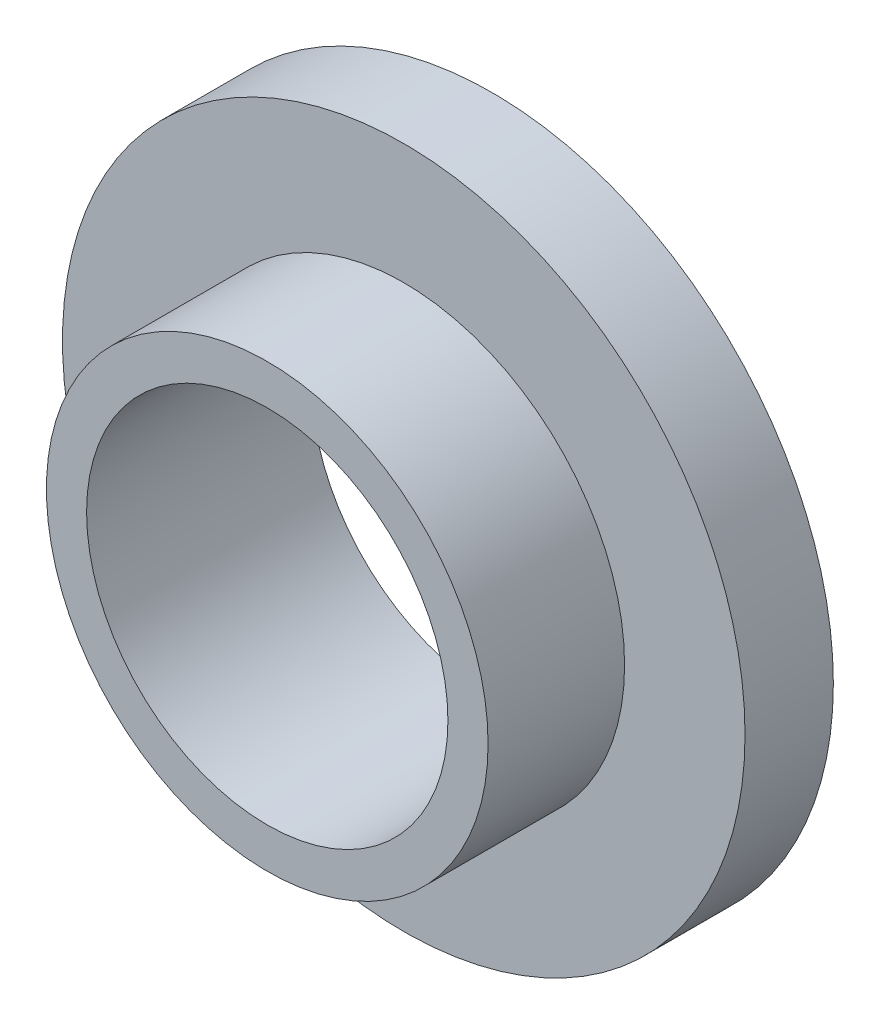
ISO-10303-21;
HEADER;
FILE_DESCRIPTION(('STEP AP214'),'2;1');
FILE_NAME('part.step','',(''),(''),'','','');
FILE_SCHEMA(('AUTOMOTIVE_DESIGN { 1 0 10303 214 1 1 1 1 }'));
ENDSEC;
DATA;
#1=APPLICATION_CONTEXT('core data for automotive mechanical design processes');
#2=APPLICATION_PROTOCOL_DEFINITION('international standard','automotive_design',2000,#1);
#3=PRODUCT_CONTEXT('',#1,'mechanical');
#4=PRODUCT('Part','Part','',(#3));
#5=PRODUCT_RELATED_PRODUCT_CATEGORY('part','',(#4));
#6=PRODUCT_DEFINITION_FORMATION('','',#4);
#7=PRODUCT_DEFINITION_CONTEXT('part definition',#1,'design');
#8=PRODUCT_DEFINITION('design','',#6,#7);
#9=PRODUCT_DEFINITION_SHAPE('','',#8);
#10=(LENGTH_UNIT() NAMED_UNIT(*) SI_UNIT(.MILLI.,.METRE.));
#11=(NAMED_UNIT(*) PLANE_ANGLE_UNIT() SI_UNIT($,.RADIAN.));
#12=(NAMED_UNIT(*) SI_UNIT($,.STERADIAN.) SOLID_ANGLE_UNIT());
#13=UNCERTAINTY_MEASURE_WITH_UNIT(LENGTH_MEASURE(1.E-05),#10,'distance_accuracy_value','');
#14=(GEOMETRIC_REPRESENTATION_CONTEXT(3) GLOBAL_UNCERTAINTY_ASSIGNED_CONTEXT((#13)) GLOBAL_UNIT_ASSIGNED_CONTEXT((#10,
#11,#12)) REPRESENTATION_CONTEXT('',''));
#15=CARTESIAN_POINT('',(0.,0.,0.));
#16=DIRECTION('',(0.,0.,1.));
#17=DIRECTION('',(1.,0.,0.));
#18=AXIS2_PLACEMENT_3D('',#15,#16,#17);
#19=CARTESIAN_POINT('',(0.,0.,1.1));
#20=DIRECTION('',(0.,0.,1.));
#21=DIRECTION('',(1.,0.,0.));
#22=AXIS2_PLACEMENT_3D('',#19,#20,#21);
#23=PLANE('',#22);
#24=CARTESIAN_POINT('',(0.,0.,1.1));
#25=DIRECTION('',(0.,0.,1.));
#26=DIRECTION('',(1.,0.,0.));
#27=AXIS2_PLACEMENT_3D('',#24,#25,#26);
#28=CIRCLE('',#27,4.25);
#29=CARTESIAN_POINT('',(4.25,0.,1.1));
#30=VERTEX_POINT('',#29);
#31=EDGE_CURVE('E10',#30,#30,#28,.T.);
#32=ORIENTED_EDGE('',*,*,#31,.T.);
#33=EDGE_LOOP('',(#32));
#34=FACE_BOUND('',#33,.T.);
#35=CARTESIAN_POINT('',(0.,0.,1.1));
#36=DIRECTION('',(0.,0.,1.));
#37=DIRECTION('',(1.,0.,0.));
#38=AXIS2_PLACEMENT_3D('',#35,#36,#37);
#39=CIRCLE('',#38,2.75);
#40=CARTESIAN_POINT('',(2.75,0.,1.1));
#41=VERTEX_POINT('',#40);
#42=EDGE_CURVE('E60',#41,#41,#39,.T.);
#43=ORIENTED_EDGE('',*,*,#42,.F.);
#44=EDGE_LOOP('',(#43));
#45=FACE_BOUND('',#44,.T.);
#46=ADVANCED_FACE('F41',(#34,#45),#23,.T.);
#47=CARTESIAN_POINT('',(0.,0.,0.));
#48=DIRECTION('',(0.,0.,1.));
#49=DIRECTION('',(1.,0.,0.));
#50=AXIS2_PLACEMENT_3D('',#47,#48,#49);
#51=PLANE('',#50);
#52=CARTESIAN_POINT('',(0.,0.,0.));
#53=DIRECTION('',(0.,0.,1.));
#54=DIRECTION('',(1.,0.,0.));
#55=AXIS2_PLACEMENT_3D('',#52,#53,#54);
#56=CIRCLE('',#55,4.25);
#57=CARTESIAN_POINT('',(4.25,0.,0.));
#58=VERTEX_POINT('',#57);
#59=EDGE_CURVE('E45',#58,#58,#56,.T.);
#60=ORIENTED_EDGE('',*,*,#59,.F.);
#61=EDGE_LOOP('',(#60));
#62=FACE_BOUND('',#61,.T.);
#63=CARTESIAN_POINT('',(0.,0.,0.));
#64=DIRECTION('',(0.,0.,1.));
#65=DIRECTION('',(1.,0.,0.));
#66=AXIS2_PLACEMENT_3D('',#63,#64,#65);
#67=CIRCLE('',#66,2.25);
#68=CARTESIAN_POINT('',(2.25,0.,0.));
#69=VERTEX_POINT('',#68);
#70=EDGE_CURVE('E54',#69,#69,#67,.T.);
#71=ORIENTED_EDGE('',*,*,#70,.T.);
#72=EDGE_LOOP('',(#71));
#73=FACE_BOUND('',#72,.T.);
#74=ADVANCED_FACE('F88',(#62,#73),#51,.F.);
#75=CARTESIAN_POINT('',(0.,0.,1.1));
#76=DIRECTION('',(0.,0.,-1.));
#77=DIRECTION('',(-1.,0.,0.));
#78=AXIS2_PLACEMENT_3D('',#75,#76,#77);
#79=CYLINDRICAL_SURFACE('',#78,4.25);
#80=ORIENTED_EDGE('',*,*,#31,.F.);
#81=EDGE_LOOP('',(#80));
#82=FACE_BOUND('',#81,.T.);
#83=ORIENTED_EDGE('',*,*,#59,.T.);
#84=EDGE_LOOP('',(#83));
#85=FACE_BOUND('',#84,.T.);
#86=ADVANCED_FACE('F43',(#82,#85),#79,.T.);
#87=CARTESIAN_POINT('',(0.,0.,1.1));
#88=DIRECTION('',(0.,0.,-1.));
#89=DIRECTION('',(-1.,0.,0.));
#90=AXIS2_PLACEMENT_3D('',#87,#88,#89);
#91=CYLINDRICAL_SURFACE('',#90,2.25);
#92=ORIENTED_EDGE('',*,*,#70,.F.);
#93=EDGE_LOOP('',(#92));
#94=FACE_BOUND('',#93,.T.);
#95=CARTESIAN_POINT('',(0.,0.,2.8));
#96=DIRECTION('',(0.,0.,1.));
#97=DIRECTION('',(1.,0.,0.));
#98=AXIS2_PLACEMENT_3D('',#95,#96,#97);
#99=CIRCLE('',#98,2.25);
#100=CARTESIAN_POINT('',(2.25,0.,2.8));
#101=VERTEX_POINT('',#100);
#102=EDGE_CURVE('E64',#101,#101,#99,.T.);
#103=ORIENTED_EDGE('',*,*,#102,.T.);
#104=EDGE_LOOP('',(#103));
#105=FACE_BOUND('',#104,.T.);
#106=ADVANCED_FACE('F72',(#94,#105),#91,.F.);
#107=CARTESIAN_POINT('',(0.,0.,2.8));
#108=DIRECTION('',(0.,0.,1.));
#109=DIRECTION('',(1.,0.,0.));
#110=AXIS2_PLACEMENT_3D('',#107,#108,#109);
#111=PLANE('',#110);
#112=CARTESIAN_POINT('',(0.,0.,2.8));
#113=DIRECTION('',(0.,0.,1.));
#114=DIRECTION('',(1.,0.,0.));
#115=AXIS2_PLACEMENT_3D('',#112,#113,#114);
#116=CIRCLE('',#115,2.75);
#117=CARTESIAN_POINT('',(2.75,0.,2.8));
#118=VERTEX_POINT('',#117);
#119=EDGE_CURVE('E59',#118,#118,#116,.T.);
#120=ORIENTED_EDGE('',*,*,#119,.T.);
#121=EDGE_LOOP('',(#120));
#122=FACE_BOUND('',#121,.T.);
#123=ORIENTED_EDGE('',*,*,#102,.F.);
#124=EDGE_LOOP('',(#123));
#125=FACE_BOUND('',#124,.T.);
#126=ADVANCED_FACE('F74',(#122,#125),#111,.T.);
#127=CARTESIAN_POINT('',(0.,0.,2.8));
#128=DIRECTION('',(0.,0.,-1.));
#129=DIRECTION('',(-1.,0.,0.));
#130=AXIS2_PLACEMENT_3D('',#127,#128,#129);
#131=CYLINDRICAL_SURFACE('',#130,2.75);
#132=ORIENTED_EDGE('',*,*,#119,.F.);
#133=EDGE_LOOP('',(#132));
#134=FACE_BOUND('',#133,.T.);
#135=ORIENTED_EDGE('',*,*,#42,.T.);
#136=EDGE_LOOP('',(#135));
#137=FACE_BOUND('',#136,.T.);
#138=ADVANCED_FACE('F76',(#134,#137),#131,.T.);
#139=CLOSED_SHELL('',(#46,#74,#86,#106,#126,#138));
#140=MANIFOLD_SOLID_BREP('B2',#139);
#141=ADVANCED_BREP_SHAPE_REPRESENTATION('',(#18,#140),#14);
#142=SHAPE_DEFINITION_REPRESENTATION(#9,#141);
ENDSEC;
END-ISO-10303-21;
